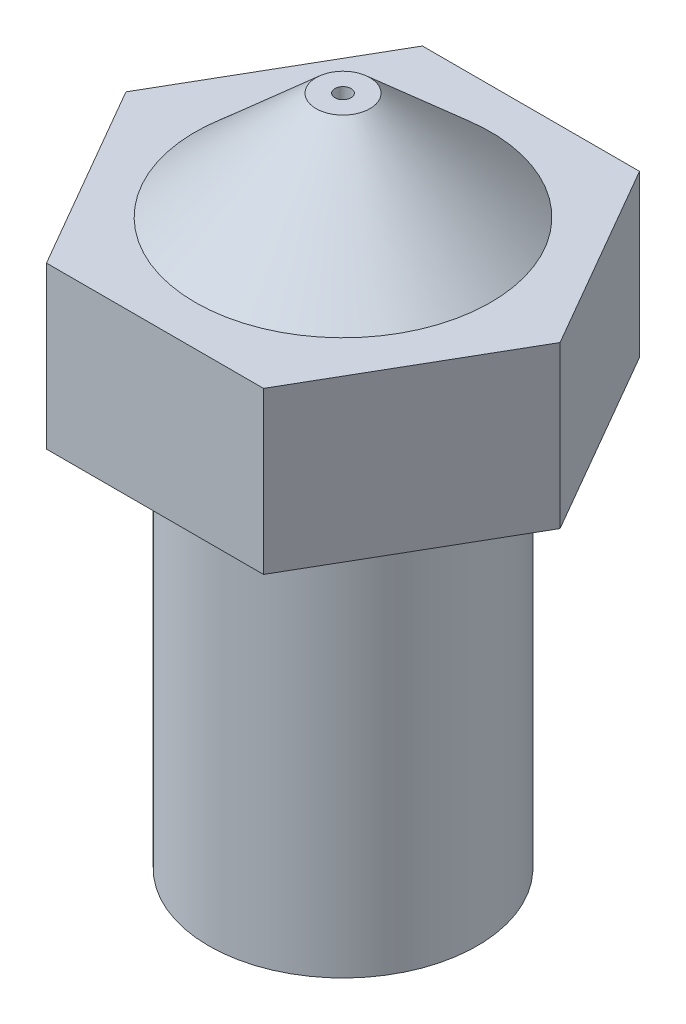
ISO-10303-21;
HEADER;
FILE_DESCRIPTION(('STEP AP214'),'2;1');
FILE_NAME('part.step','',(''),(''),'','','');
FILE_SCHEMA(('AUTOMOTIVE_DESIGN { 1 0 10303 214 1 1 1 1 }'));
ENDSEC;
DATA;
#1=APPLICATION_CONTEXT('core data for automotive mechanical design processes');
#2=APPLICATION_PROTOCOL_DEFINITION('international standard','automotive_design',2000,#1);
#3=PRODUCT_CONTEXT('',#1,'mechanical');
#4=PRODUCT('Part','Part','',(#3));
#5=PRODUCT_RELATED_PRODUCT_CATEGORY('part','',(#4));
#6=PRODUCT_DEFINITION_FORMATION('','',#4);
#7=PRODUCT_DEFINITION_CONTEXT('part definition',#1,'design');
#8=PRODUCT_DEFINITION('design','',#6,#7);
#9=PRODUCT_DEFINITION_SHAPE('','',#8);
#10=(LENGTH_UNIT() NAMED_UNIT(*) SI_UNIT(.MILLI.,.METRE.));
#11=(NAMED_UNIT(*) PLANE_ANGLE_UNIT() SI_UNIT($,.RADIAN.));
#12=(NAMED_UNIT(*) SI_UNIT($,.STERADIAN.) SOLID_ANGLE_UNIT());
#13=UNCERTAINTY_MEASURE_WITH_UNIT(LENGTH_MEASURE(1.E-05),#10,'distance_accuracy_value','');
#14=(GEOMETRIC_REPRESENTATION_CONTEXT(3) GLOBAL_UNCERTAINTY_ASSIGNED_CONTEXT((#13)) GLOBAL_UNIT_ASSIGNED_CONTEXT((#10,
#11,#12)) REPRESENTATION_CONTEXT('',''));
#15=CARTESIAN_POINT('',(0.,0.,0.));
#16=DIRECTION('',(0.,0.,1.));
#17=DIRECTION('',(1.,0.,0.));
#18=AXIS2_PLACEMENT_3D('',#15,#16,#17);
#19=CARTESIAN_POINT('',(2.02072594216373,3.,3.49999999999998));
#20=DIRECTION('',(-0.866025403784441,0.,-0.499999999999995));
#21=DIRECTION('',(-0.499999999999995,0.,0.866025403784442));
#22=AXIS2_PLACEMENT_3D('',#19,#20,#21);
#23=PLANE('',#22);
#24=DIRECTION('',(0.499999999999995,0.,-0.866025403784442));
#25=VECTOR('',#24,1.);
#26=CARTESIAN_POINT('',(2.02072594216373,0.,3.49999999999998));
#27=LINE('',#26,#25);
#28=CARTESIAN_POINT('',(2.02072594216373,0.,3.49999999999998));
#29=VERTEX_POINT('',#28);
#30=CARTESIAN_POINT('',(4.04145188432738,0.,0.));
#31=VERTEX_POINT('',#30);
#32=EDGE_CURVE('E128',#29,#31,#27,.T.);
#33=ORIENTED_EDGE('',*,*,#32,.T.);
#34=DIRECTION('',(0.,-1.,0.));
#35=VECTOR('',#34,1.);
#36=CARTESIAN_POINT('',(4.04145188432738,3.,0.));
#37=LINE('',#36,#35);
#38=CARTESIAN_POINT('',(4.04145188432738,3.,0.));
#39=VERTEX_POINT('',#38);
#40=EDGE_CURVE('E44',#39,#31,#37,.T.);
#41=ORIENTED_EDGE('',*,*,#40,.F.);
#42=DIRECTION('',(0.499999999999995,0.,-0.866025403784442));
#43=VECTOR('',#42,1.);
#44=CARTESIAN_POINT('',(2.02072594216373,3.,3.49999999999998));
#45=LINE('',#44,#43);
#46=CARTESIAN_POINT('',(2.02072594216373,3.,3.49999999999998));
#47=VERTEX_POINT('',#46);
#48=EDGE_CURVE('E139',#47,#39,#45,.T.);
#49=ORIENTED_EDGE('',*,*,#48,.F.);
#50=DIRECTION('',(0.,-1.,0.));
#51=VECTOR('',#50,1.);
#52=CARTESIAN_POINT('',(2.02072594216373,3.,3.49999999999998));
#53=LINE('',#52,#51);
#54=EDGE_CURVE('E124',#47,#29,#53,.T.);
#55=ORIENTED_EDGE('',*,*,#54,.T.);
#56=EDGE_LOOP('',(#33,#41,#49,#55));
#57=FACE_BOUND('',#56,.T.);
#58=ADVANCED_FACE('F41',(#57),#23,.F.);
#59=CARTESIAN_POINT('',(4.04145188432738,3.,0.));
#60=DIRECTION('',(-0.866025403784438,0.,0.500000000000001));
#61=DIRECTION('',(0.500000000000001,0.,0.866025403784438));
#62=AXIS2_PLACEMENT_3D('',#59,#60,#61);
#63=PLANE('',#62);
#64=DIRECTION('',(-0.500000000000001,0.,-0.866025403784438));
#65=VECTOR('',#64,1.);
#66=CARTESIAN_POINT('',(4.04145188432738,0.,0.));
#67=LINE('',#66,#65);
#68=CARTESIAN_POINT('',(2.02072594216368,0.,-3.50000000000001));
#69=VERTEX_POINT('',#68);
#70=EDGE_CURVE('E131',#31,#69,#67,.T.);
#71=ORIENTED_EDGE('',*,*,#70,.T.);
#72=DIRECTION('',(0.,-1.,0.));
#73=VECTOR('',#72,1.);
#74=CARTESIAN_POINT('',(2.02072594216368,3.,-3.50000000000001));
#75=LINE('',#74,#73);
#76=CARTESIAN_POINT('',(2.02072594216368,3.,-3.50000000000001));
#77=VERTEX_POINT('',#76);
#78=EDGE_CURVE('E142',#77,#69,#75,.T.);
#79=ORIENTED_EDGE('',*,*,#78,.F.);
#80=DIRECTION('',(-0.500000000000001,0.,-0.866025403784438));
#81=VECTOR('',#80,1.);
#82=CARTESIAN_POINT('',(4.04145188432738,3.,0.));
#83=LINE('',#82,#81);
#84=EDGE_CURVE('E97',#39,#77,#83,.T.);
#85=ORIENTED_EDGE('',*,*,#84,.F.);
#86=ORIENTED_EDGE('',*,*,#40,.T.);
#87=EDGE_LOOP('',(#71,#79,#85,#86));
#88=FACE_BOUND('',#87,.T.);
#89=ADVANCED_FACE('F159',(#88),#63,.F.);
#90=CARTESIAN_POINT('',(2.02072594216368,3.,-3.50000000000001));
#91=DIRECTION('',(0.,0.,1.));
#92=DIRECTION('',(1.,0.,0.));
#93=AXIS2_PLACEMENT_3D('',#90,#91,#92);
#94=PLANE('',#93);
#95=DIRECTION('',(-1.,0.,0.));
#96=VECTOR('',#95,1.);
#97=CARTESIAN_POINT('',(2.02072594216368,0.,-3.50000000000001));
#98=LINE('',#97,#96);
#99=CARTESIAN_POINT('',(-2.02072594216371,0.,-3.49999999999999));
#100=VERTEX_POINT('',#99);
#101=EDGE_CURVE('E134',#69,#100,#98,.T.);
#102=ORIENTED_EDGE('',*,*,#101,.T.);
#103=DIRECTION('',(0.,-1.,0.));
#104=VECTOR('',#103,1.);
#105=CARTESIAN_POINT('',(-2.02072594216371,3.,-3.49999999999999));
#106=LINE('',#105,#104);
#107=CARTESIAN_POINT('',(-2.02072594216371,3.,-3.49999999999999));
#108=VERTEX_POINT('',#107);
#109=EDGE_CURVE('E119',#108,#100,#106,.T.);
#110=ORIENTED_EDGE('',*,*,#109,.F.);
#111=DIRECTION('',(-1.,0.,0.));
#112=VECTOR('',#111,1.);
#113=CARTESIAN_POINT('',(2.02072594216368,3.,-3.50000000000001));
#114=LINE('',#113,#112);
#115=EDGE_CURVE('E110',#77,#108,#114,.T.);
#116=ORIENTED_EDGE('',*,*,#115,.F.);
#117=ORIENTED_EDGE('',*,*,#78,.T.);
#118=EDGE_LOOP('',(#102,#110,#116,#117));
#119=FACE_BOUND('',#118,.T.);
#120=ADVANCED_FACE('F160',(#119),#94,.F.);
#121=CARTESIAN_POINT('',(-2.02072594216371,3.,-3.49999999999999));
#122=DIRECTION('',(0.866025403784441,0.,0.499999999999995));
#123=DIRECTION('',(0.499999999999995,0.,-0.866025403784442));
#124=AXIS2_PLACEMENT_3D('',#121,#122,#123);
#125=PLANE('',#124);
#126=DIRECTION('',(-0.499999999999995,0.,0.866025403784441));
#127=VECTOR('',#126,1.);
#128=CARTESIAN_POINT('',(-2.02072594216371,0.,-3.49999999999999));
#129=LINE('',#128,#127);
#130=CARTESIAN_POINT('',(-4.04145188432738,0.,0.));
#131=VERTEX_POINT('',#130);
#132=EDGE_CURVE('E118',#100,#131,#129,.T.);
#133=ORIENTED_EDGE('',*,*,#132,.T.);
#134=DIRECTION('',(0.,-1.,0.));
#135=VECTOR('',#134,1.);
#136=CARTESIAN_POINT('',(-4.04145188432738,3.,0.));
#137=LINE('',#136,#135);
#138=CARTESIAN_POINT('',(-4.04145188432738,3.,0.));
#139=VERTEX_POINT('',#138);
#140=EDGE_CURVE('E115',#139,#131,#137,.T.);
#141=ORIENTED_EDGE('',*,*,#140,.F.);
#142=DIRECTION('',(-0.499999999999995,0.,0.866025403784441));
#143=VECTOR('',#142,1.);
#144=CARTESIAN_POINT('',(-2.02072594216371,3.,-3.49999999999999));
#145=LINE('',#144,#143);
#146=EDGE_CURVE('E104',#108,#139,#145,.T.);
#147=ORIENTED_EDGE('',*,*,#146,.F.);
#148=ORIENTED_EDGE('',*,*,#109,.T.);
#149=EDGE_LOOP('',(#133,#141,#147,#148));
#150=FACE_BOUND('',#149,.T.);
#151=ADVANCED_FACE('F116',(#150),#125,.F.);
#152=CARTESIAN_POINT('',(-4.04145188432738,3.,0.));
#153=DIRECTION('',(0.866025403784435,0.,-0.500000000000007));
#154=DIRECTION('',(-0.500000000000007,0.,-0.866025403784434));
#155=AXIS2_PLACEMENT_3D('',#152,#153,#154);
#156=PLANE('',#155);
#157=DIRECTION('',(0.500000000000007,0.,0.866025403784435));
#158=VECTOR('',#157,1.);
#159=CARTESIAN_POINT('',(-4.04145188432738,0.,0.));
#160=LINE('',#159,#158);
#161=CARTESIAN_POINT('',(-2.02072594216366,0.,3.50000000000002));
#162=VERTEX_POINT('',#161);
#163=EDGE_CURVE('E82',#131,#162,#160,.T.);
#164=ORIENTED_EDGE('',*,*,#163,.T.);
#165=DIRECTION('',(0.,-1.,0.));
#166=VECTOR('',#165,1.);
#167=CARTESIAN_POINT('',(-2.02072594216366,3.,3.50000000000002));
#168=LINE('',#167,#166);
#169=CARTESIAN_POINT('',(-2.02072594216366,3.,3.50000000000002));
#170=VERTEX_POINT('',#169);
#171=EDGE_CURVE('E120',#170,#162,#168,.T.);
#172=ORIENTED_EDGE('',*,*,#171,.F.);
#173=DIRECTION('',(0.500000000000007,0.,0.866025403784435));
#174=VECTOR('',#173,1.);
#175=CARTESIAN_POINT('',(-4.04145188432738,3.,0.));
#176=LINE('',#175,#174);
#177=EDGE_CURVE('E108',#139,#170,#176,.T.);
#178=ORIENTED_EDGE('',*,*,#177,.F.);
#179=ORIENTED_EDGE('',*,*,#140,.T.);
#180=EDGE_LOOP('',(#164,#172,#178,#179));
#181=FACE_BOUND('',#180,.T.);
#182=ADVANCED_FACE('F122',(#181),#156,.F.);
#183=CARTESIAN_POINT('',(-2.02072594216366,3.,3.50000000000002));
#184=DIRECTION('',(0.,0.,-1.));
#185=DIRECTION('',(-1.,0.,0.));
#186=AXIS2_PLACEMENT_3D('',#183,#184,#185);
#187=PLANE('',#186);
#188=DIRECTION('',(1.,0.,0.));
#189=VECTOR('',#188,1.);
#190=CARTESIAN_POINT('',(-2.02072594216366,0.,3.50000000000002));
#191=LINE('',#190,#189);
#192=EDGE_CURVE('E88',#162,#29,#191,.T.);
#193=ORIENTED_EDGE('',*,*,#192,.T.);
#194=ORIENTED_EDGE('',*,*,#54,.F.);
#195=DIRECTION('',(1.,0.,0.));
#196=VECTOR('',#195,1.);
#197=CARTESIAN_POINT('',(-2.02072594216366,3.,3.50000000000002));
#198=LINE('',#197,#196);
#199=EDGE_CURVE('E59',#170,#47,#198,.T.);
#200=ORIENTED_EDGE('',*,*,#199,.F.);
#201=ORIENTED_EDGE('',*,*,#171,.T.);
#202=EDGE_LOOP('',(#193,#194,#200,#201));
#203=FACE_BOUND('',#202,.T.);
#204=ADVANCED_FACE('F165',(#203),#187,.F.);
#205=CARTESIAN_POINT('',(0.,3.,0.));
#206=DIRECTION('',(0.,1.,0.));
#207=DIRECTION('',(0.,0.,1.));
#208=AXIS2_PLACEMENT_3D('',#205,#206,#207);
#209=PLANE('',#208);
#210=CARTESIAN_POINT('',(0.,3.,0.));
#211=DIRECTION('',(0.,1.,0.));
#212=DIRECTION('',(0.,0.,1.));
#213=AXIS2_PLACEMENT_3D('',#210,#211,#212);
#214=CIRCLE('',#213,2.75);
#215=CARTESIAN_POINT('',(0.,3.,2.75));
#216=VERTEX_POINT('',#215);
#217=EDGE_CURVE('E50',#216,#216,#214,.T.);
#218=ORIENTED_EDGE('',*,*,#217,.F.);
#219=EDGE_LOOP('',(#218));
#220=FACE_BOUND('',#219,.T.);
#221=ORIENTED_EDGE('',*,*,#48,.T.);
#222=ORIENTED_EDGE('',*,*,#84,.T.);
#223=ORIENTED_EDGE('',*,*,#115,.T.);
#224=ORIENTED_EDGE('',*,*,#146,.T.);
#225=ORIENTED_EDGE('',*,*,#177,.T.);
#226=ORIENTED_EDGE('',*,*,#199,.T.);
#227=EDGE_LOOP('',(#221,#222,#223,#224,#225,#226));
#228=FACE_BOUND('',#227,.T.);
#229=ADVANCED_FACE('F106',(#220,#228),#209,.T.);
#230=CARTESIAN_POINT('',(0.,0.,0.));
#231=DIRECTION('',(0.,1.,0.));
#232=DIRECTION('',(0.,0.,1.));
#233=AXIS2_PLACEMENT_3D('',#230,#231,#232);
#234=PLANE('',#233);
#235=CARTESIAN_POINT('',(0.,0.,0.));
#236=DIRECTION('',(0.,-1.,0.));
#237=DIRECTION('',(0.,0.,-1.));
#238=AXIS2_PLACEMENT_3D('',#235,#236,#237);
#239=CIRCLE('',#238,2.5);
#240=CARTESIAN_POINT('',(0.,0.,-2.5));
#241=VERTEX_POINT('',#240);
#242=EDGE_CURVE('E11',#241,#241,#239,.T.);
#243=ORIENTED_EDGE('',*,*,#242,.F.);
#244=EDGE_LOOP('',(#243));
#245=FACE_BOUND('',#244,.T.);
#246=ORIENTED_EDGE('',*,*,#32,.F.);
#247=ORIENTED_EDGE('',*,*,#192,.F.);
#248=ORIENTED_EDGE('',*,*,#163,.F.);
#249=ORIENTED_EDGE('',*,*,#132,.F.);
#250=ORIENTED_EDGE('',*,*,#101,.F.);
#251=ORIENTED_EDGE('',*,*,#70,.F.);
#252=EDGE_LOOP('',(#246,#247,#248,#249,#250,#251));
#253=FACE_BOUND('',#252,.T.);
#254=ADVANCED_FACE('F163',(#245,#253),#234,.F.);
#255=CARTESIAN_POINT('',(0.,3.,0.));
#256=DIRECTION('',(0.,-1.,0.));
#257=DIRECTION('',(0.,0.,1.));
#258=AXIS2_PLACEMENT_3D('',#255,#256,#257);
#259=CONICAL_SURFACE('',#258,2.75,0.84404122626446);
#260=CARTESIAN_POINT('',(0.,5.,0.));
#261=DIRECTION('',(0.,1.,0.));
#262=DIRECTION('',(0.,0.,1.));
#263=AXIS2_PLACEMENT_3D('',#260,#261,#262);
#264=CIRCLE('',#263,0.500510878259264);
#265=CARTESIAN_POINT('',(0.,5.,0.500510878259264));
#266=VERTEX_POINT('',#265);
#267=EDGE_CURVE('E132',#266,#266,#264,.T.);
#268=CARTESIAN_POINT('',(0.,5.,0.500510878259264));
#269=CARTESIAN_POINT('',(0.,4.97916666666667,0.52394305661073));
#270=CARTESIAN_POINT('',(0.,4.95833333333333,0.547375234962196));
#271=CARTESIAN_POINT('',(0.,4.91666666666667,0.594239591665128));
#272=CARTESIAN_POINT('',(0.,4.89583333333333,0.617671770016594));
#273=CARTESIAN_POINT('',(0.,4.85416666666667,0.664536126719526));
#274=CARTESIAN_POINT('',(0.,4.83333333333333,0.687968305070992));
#275=CARTESIAN_POINT('',(0.,4.79166666666667,0.734832661773924));
#276=CARTESIAN_POINT('',(0.,4.77083333333333,0.75826484012539));
#277=CARTESIAN_POINT('',(0.,4.72916666666667,0.805129196828322));
#278=CARTESIAN_POINT('',(0.,4.70833333333333,0.828561375179788));
#279=CARTESIAN_POINT('',(0.,4.66666666666667,0.87542573188272));
#280=CARTESIAN_POINT('',(0.,4.64583333333333,0.898857910234186));
#281=CARTESIAN_POINT('',(0.,4.60416666666667,0.945722266937118));
#282=CARTESIAN_POINT('',(0.,4.58333333333333,0.969154445288584));
#283=CARTESIAN_POINT('',(0.,4.54166666666667,1.01601880199152));
#284=CARTESIAN_POINT('',(0.,4.52083333333333,1.03945098034298));
#285=CARTESIAN_POINT('',(0.,4.47916666666667,1.08631533704591));
#286=CARTESIAN_POINT('',(0.,4.45833333333333,1.10974751539738));
#287=CARTESIAN_POINT('',(0.,4.41666666666667,1.15661187210031));
#288=CARTESIAN_POINT('',(0.,4.39583333333333,1.18004405045178));
#289=CARTESIAN_POINT('',(0.,4.35416666666667,1.22690840715471));
#290=CARTESIAN_POINT('',(0.,4.33333333333333,1.25034058550618));
#291=CARTESIAN_POINT('',(0.,4.29166666666667,1.29720494220911));
#292=CARTESIAN_POINT('',(0.,4.27083333333333,1.32063712056057));
#293=CARTESIAN_POINT('',(0.,4.22916666666667,1.36750147726351));
#294=CARTESIAN_POINT('',(0.,4.20833333333333,1.39093365561497));
#295=CARTESIAN_POINT('',(0.,4.16666666666667,1.4377980123179));
#296=CARTESIAN_POINT('',(0.,4.14583333333333,1.46123019066937));
#297=CARTESIAN_POINT('',(0.,4.10416666666667,1.5080945473723));
#298=CARTESIAN_POINT('',(0.,4.08333333333333,1.53152672572377));
#299=CARTESIAN_POINT('',(0.,4.04166666666667,1.5783910824267));
#300=CARTESIAN_POINT('',(0.,4.02083333333333,1.60182326077817));
#301=CARTESIAN_POINT('',(0.,3.97916666666667,1.6486876174811));
#302=CARTESIAN_POINT('',(0.,3.95833333333333,1.67211979583256));
#303=CARTESIAN_POINT('',(0.,3.91666666666667,1.7189841525355));
#304=CARTESIAN_POINT('',(0.,3.89583333333333,1.74241633088696));
#305=CARTESIAN_POINT('',(0.,3.85416666666667,1.78928068758989));
#306=CARTESIAN_POINT('',(0.,3.83333333333333,1.81271286594136));
#307=CARTESIAN_POINT('',(0.,3.79166666666667,1.85957722264429));
#308=CARTESIAN_POINT('',(0.,3.77083333333333,1.88300940099576));
#309=CARTESIAN_POINT('',(0.,3.72916666666667,1.92987375769869));
#310=CARTESIAN_POINT('',(0.,3.70833333333333,1.95330593605016));
#311=CARTESIAN_POINT('',(0.,3.66666666666667,2.00017029275309));
#312=CARTESIAN_POINT('',(0.,3.64583333333333,2.02360247110455));
#313=CARTESIAN_POINT('',(0.,3.60416666666667,2.07046682780749));
#314=CARTESIAN_POINT('',(0.,3.58333333333333,2.09389900615895));
#315=CARTESIAN_POINT('',(0.,3.54166666666667,2.14076336286188));
#316=CARTESIAN_POINT('',(0.,3.52083333333333,2.16419554121335));
#317=CARTESIAN_POINT('',(0.,3.47916666666667,2.21105989791628));
#318=CARTESIAN_POINT('',(0.,3.45833333333333,2.23449207626775));
#319=CARTESIAN_POINT('',(0.,3.41666666666667,2.28135643297068));
#320=CARTESIAN_POINT('',(0.,3.39583333333333,2.30478861132215));
#321=CARTESIAN_POINT('',(0.,3.35416666666667,2.35165296802508));
#322=CARTESIAN_POINT('',(0.,3.33333333333333,2.37508514637654));
#323=CARTESIAN_POINT('',(0.,3.29166666666667,2.42194950307948));
#324=CARTESIAN_POINT('',(0.,3.27083333333333,2.44538168143094));
#325=CARTESIAN_POINT('',(0.,3.22916666666667,2.49224603813387));
#326=CARTESIAN_POINT('',(0.,3.20833333333333,2.51567821648534));
#327=CARTESIAN_POINT('',(0.,3.16666666666667,2.56254257318827));
#328=CARTESIAN_POINT('',(0.,3.14583333333333,2.58597475153974));
#329=CARTESIAN_POINT('',(0.,3.10416666666667,2.63283910824267));
#330=CARTESIAN_POINT('',(0.,3.08333333333333,2.65627128659414));
#331=CARTESIAN_POINT('',(0.,3.04166666666667,2.70313564329707));
#332=CARTESIAN_POINT('',(0.,3.02083333333333,2.72656782164853));
#333=CARTESIAN_POINT('',(0.,3.,2.75));
#334=B_SPLINE_CURVE_WITH_KNOTS('',3,(#268,#269,#270,#271,#272,#273,#274,#275,#276,#277,#278,
#279,#280,#281,#282,#283,#284,#285,#286,#287,#288,#289,#290,#291,#292,#293,#294,#295,#296,#297,
#298,#299,#300,#301,#302,#303,#304,#305,#306,#307,#308,#309,#310,#311,#312,#313,#314,#315,#316,
#317,#318,#319,#320,#321,#322,#323,#324,#325,#326,#327,#328,#329,#330,#331,#332,#333),
.UNSPECIFIED.,.F.,.F.,(4,2,2,2,2,2,2,2,2,2,2,2,2,2,2,2,2,2,2,2,2,2,2,2,2,2,2,2,2,2,2,2,4),(0.,
0.0940630258956951,0.18812605179139,0.282189077687086,0.376252103582781,0.470315129478476,
0.564378155374171,0.658441181269866,0.752504207165561,0.846567233061256,0.940630258956951,
1.03469328485265,1.12875631074834,1.22281933664404,1.31688236253973,1.41094538843543,
1.50500841433112,1.59907144022682,1.69313446612251,1.78719749201821,1.8812605179139,
1.9753235438096,2.06938656970529,2.16344959560099,2.25751262149668,2.35157564739238,
2.44563867328807,2.53970169918377,2.63376472507946,2.72782775097516,2.82189077687085,
2.91595380276655,3.01001682866224),.UNSPECIFIED.);
#335=EDGE_CURVE('BSEAM211',#266,#216,#334,.T.);
#336=ORIENTED_EDGE('',*,*,#267,.F.);
#337=ORIENTED_EDGE('',*,*,#217,.T.);
#338=ORIENTED_EDGE('',*,*,#335,.T.);
#339=ORIENTED_EDGE('',*,*,#335,.F.);
#340=EDGE_LOOP('',(#336,#338,#337,#339));
#341=FACE_BOUND('',#340,.T.);
#342=ADVANCED_FACE('F211',(#341),#259,.T.);
#343=CARTESIAN_POINT('',(0.,5.,0.));
#344=DIRECTION('',(0.,1.,0.));
#345=DIRECTION('',(0.,0.,1.));
#346=AXIS2_PLACEMENT_3D('',#343,#344,#345);
#347=PLANE('',#346);
#348=CARTESIAN_POINT('',(0.,5.,0.));
#349=DIRECTION('',(0.,1.,0.));
#350=DIRECTION('',(0.,0.,1.));
#351=AXIS2_PLACEMENT_3D('',#348,#349,#350);
#352=CIRCLE('',#351,0.15);
#353=CARTESIAN_POINT('',(0.,5.,0.15));
#354=VERTEX_POINT('',#353);
#355=EDGE_CURVE('E153',#354,#354,#352,.T.);
#356=ORIENTED_EDGE('',*,*,#355,.F.);
#357=EDGE_LOOP('',(#356));
#358=FACE_BOUND('',#357,.T.);
#359=ORIENTED_EDGE('',*,*,#267,.T.);
#360=EDGE_LOOP('',(#359));
#361=FACE_BOUND('',#360,.T.);
#362=ADVANCED_FACE('F216',(#358,#361),#347,.T.);
#363=CARTESIAN_POINT('',(0.,3.5,0.));
#364=DIRECTION('',(0.,1.,0.));
#365=DIRECTION('',(0.,0.,1.));
#366=AXIS2_PLACEMENT_3D('',#363,#364,#365);
#367=CYLINDRICAL_SURFACE('',#366,0.15);
#368=CARTESIAN_POINT('',(0.,3.5,0.));
#369=DIRECTION('',(0.,1.,0.));
#370=DIRECTION('',(0.,0.,1.));
#371=AXIS2_PLACEMENT_3D('',#368,#369,#370);
#372=CIRCLE('',#371,0.15);
#373=CARTESIAN_POINT('',(0.,3.5,0.15));
#374=VERTEX_POINT('',#373);
#375=EDGE_CURVE('E302',#374,#374,#372,.T.);
#376=ORIENTED_EDGE('',*,*,#375,.F.);
#377=EDGE_LOOP('',(#376));
#378=FACE_BOUND('',#377,.T.);
#379=ORIENTED_EDGE('',*,*,#355,.T.);
#380=EDGE_LOOP('',(#379));
#381=FACE_BOUND('',#380,.T.);
#382=ADVANCED_FACE('F226',(#378,#381),#367,.F.);
#383=CARTESIAN_POINT('',(0.,-7.5,0.));
#384=DIRECTION('',(0.,1.,0.));
#385=DIRECTION('',(0.,0.,1.));
#386=AXIS2_PLACEMENT_3D('',#383,#384,#385);
#387=CYLINDRICAL_SURFACE('',#386,2.5);
#388=CARTESIAN_POINT('',(0.,-7.5,0.));
#389=DIRECTION('',(0.,-1.,0.));
#390=DIRECTION('',(0.,0.,-1.));
#391=AXIS2_PLACEMENT_3D('',#388,#389,#390);
#392=CIRCLE('',#391,2.5);
#393=CARTESIAN_POINT('',(0.,-7.5,-2.5));
#394=VERTEX_POINT('',#393);
#395=EDGE_CURVE('E305',#394,#394,#392,.T.);
#396=ORIENTED_EDGE('',*,*,#395,.F.);
#397=EDGE_LOOP('',(#396));
#398=FACE_BOUND('',#397,.T.);
#399=ORIENTED_EDGE('',*,*,#242,.T.);
#400=EDGE_LOOP('',(#399));
#401=FACE_BOUND('',#400,.T.);
#402=ADVANCED_FACE('F236',(#398,#401),#387,.T.);
#403=CARTESIAN_POINT('',(0.,-7.5,0.));
#404=DIRECTION('',(0.,-1.,0.));
#405=DIRECTION('',(0.,0.,-1.));
#406=AXIS2_PLACEMENT_3D('',#403,#404,#405);
#407=PLANE('',#406);
#408=CARTESIAN_POINT('',(0.,-7.5,0.));
#409=DIRECTION('',(0.,-1.,0.));
#410=DIRECTION('',(0.,0.,-1.));
#411=AXIS2_PLACEMENT_3D('',#408,#409,#410);
#412=CIRCLE('',#411,1.);
#413=CARTESIAN_POINT('',(0.,-7.5,-1.));
#414=VERTEX_POINT('',#413);
#415=EDGE_CURVE('E297',#414,#414,#412,.T.);
#416=ORIENTED_EDGE('',*,*,#415,.F.);
#417=EDGE_LOOP('',(#416));
#418=FACE_BOUND('',#417,.T.);
#419=ORIENTED_EDGE('',*,*,#395,.T.);
#420=EDGE_LOOP('',(#419));
#421=FACE_BOUND('',#420,.T.);
#422=ADVANCED_FACE('F252',(#418,#421),#407,.T.);
#423=CARTESIAN_POINT('',(0.,3.5,0.));
#424=DIRECTION('',(0.,1.,0.));
#425=DIRECTION('',(0.,0.,1.));
#426=AXIS2_PLACEMENT_3D('',#423,#424,#425);
#427=PLANE('',#426);
#428=ORIENTED_EDGE('',*,*,#375,.T.);
#429=EDGE_LOOP('',(#428));
#430=FACE_BOUND('',#429,.T.);
#431=CARTESIAN_POINT('',(0.,3.5,0.));
#432=DIRECTION('',(0.,1.,0.));
#433=DIRECTION('',(0.,0.,1.));
#434=AXIS2_PLACEMENT_3D('',#431,#432,#433);
#435=CIRCLE('',#434,1.);
#436=CARTESIAN_POINT('',(0.,3.5,1.));
#437=VERTEX_POINT('',#436);
#438=EDGE_CURVE('E300',#437,#437,#435,.F.);
#439=ORIENTED_EDGE('',*,*,#438,.T.);
#440=EDGE_LOOP('',(#439));
#441=FACE_BOUND('',#440,.T.);
#442=ADVANCED_FACE('F263',(#430,#441),#427,.F.);
#443=CARTESIAN_POINT('',(0.,6.32842712474619,0.));
#444=DIRECTION('',(0.,-1.,0.));
#445=DIRECTION('',(0.,0.,-1.));
#446=AXIS2_PLACEMENT_3D('',#443,#444,#445);
#447=CYLINDRICAL_SURFACE('',#446,1.);
#448=ORIENTED_EDGE('',*,*,#415,.T.);
#449=EDGE_LOOP('',(#448));
#450=FACE_BOUND('',#449,.T.);
#451=ORIENTED_EDGE('',*,*,#438,.F.);
#452=EDGE_LOOP('',(#451));
#453=FACE_BOUND('',#452,.T.);
#454=ADVANCED_FACE('F274',(#450,#453),#447,.F.);
#455=CLOSED_SHELL('',(#58,#89,#120,#151,#182,#204,#229,#254,#342,#362,#382,#402,#422,#442,#454));
#456=MANIFOLD_SOLID_BREP('B2',#455);
#457=ADVANCED_BREP_SHAPE_REPRESENTATION('',(#18,#456),#14);
#458=SHAPE_DEFINITION_REPRESENTATION(#9,#457);
ENDSEC;
END-ISO-10303-21;
